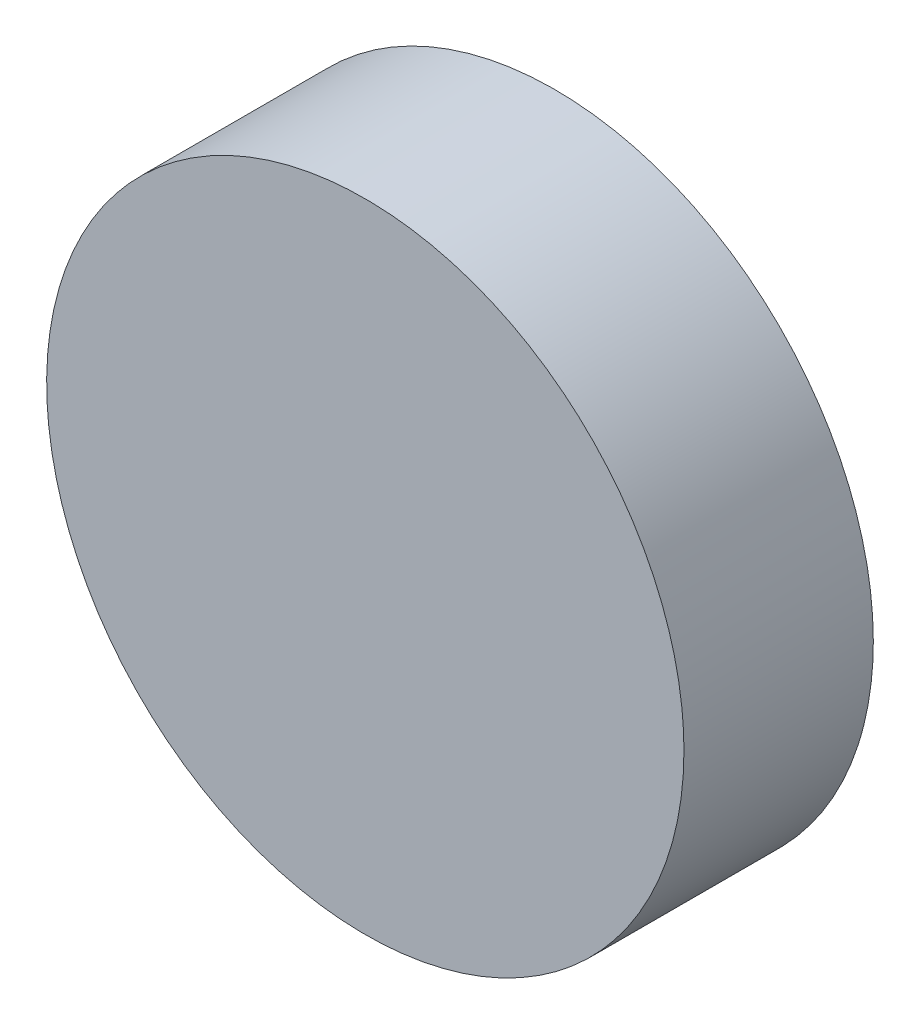
ISO-10303-21;
HEADER;
FILE_DESCRIPTION(('STEP AP214'),'2;1');
FILE_NAME('part.step','',(''),(''),'','','');
FILE_SCHEMA(('AUTOMOTIVE_DESIGN { 1 0 10303 214 1 1 1 1 }'));
ENDSEC;
DATA;
#1=APPLICATION_CONTEXT('core data for automotive mechanical design processes');
#2=APPLICATION_PROTOCOL_DEFINITION('international standard','automotive_design',2000,#1);
#3=PRODUCT_CONTEXT('',#1,'mechanical');
#4=PRODUCT('Part','Part','',(#3));
#5=PRODUCT_RELATED_PRODUCT_CATEGORY('part','',(#4));
#6=PRODUCT_DEFINITION_FORMATION('','',#4);
#7=PRODUCT_DEFINITION_CONTEXT('part definition',#1,'design');
#8=PRODUCT_DEFINITION('design','',#6,#7);
#9=PRODUCT_DEFINITION_SHAPE('','',#8);
#10=(LENGTH_UNIT() NAMED_UNIT(*) SI_UNIT(.MILLI.,.METRE.));
#11=(NAMED_UNIT(*) PLANE_ANGLE_UNIT() SI_UNIT($,.RADIAN.));
#12=(NAMED_UNIT(*) SI_UNIT($,.STERADIAN.) SOLID_ANGLE_UNIT());
#13=UNCERTAINTY_MEASURE_WITH_UNIT(LENGTH_MEASURE(1.E-05),#10,'distance_accuracy_value','');
#14=(GEOMETRIC_REPRESENTATION_CONTEXT(3) GLOBAL_UNCERTAINTY_ASSIGNED_CONTEXT((#13)) GLOBAL_UNIT_ASSIGNED_CONTEXT((#10,
#11,#12)) REPRESENTATION_CONTEXT('',''));
#15=CARTESIAN_POINT('',(0.,0.,0.));
#16=DIRECTION('',(0.,0.,1.));
#17=DIRECTION('',(1.,0.,0.));
#18=AXIS2_PLACEMENT_3D('',#15,#16,#17);
#19=CARTESIAN_POINT('',(522.173798361625,24.6841291296524,6.00670271108685));
#20=CARTESIAN_POINT('',(522.173798361625,23.7541445087742,6.00670271108685));
#21=CARTESIAN_POINT('',(521.990607380803,21.8941752670179,6.00670271108685));
#22=CARTESIAN_POINT('',(521.176807857093,19.2114377667003,6.00670271108685));
#23=CARTESIAN_POINT('',(519.855269140217,16.7390127263402,6.00670271108685));
#24=CARTESIAN_POINT('',(518.076777221937,14.5719140536869,6.00670271108685));
#25=CARTESIAN_POINT('',(515.909678549284,12.7934221354073,6.00670271108685));
#26=CARTESIAN_POINT('',(513.437253508924,11.4718834185313,6.00670271108685));
#27=CARTESIAN_POINT('',(510.754516008606,10.6580838948209,6.00670271108685));
#28=CARTESIAN_POINT('',(507.964562145972,10.3832974235883,6.00670271108685));
#29=CARTESIAN_POINT('',(505.174608283337,10.6580838948209,6.00670271108685));
#30=CARTESIAN_POINT('',(502.49187078302,11.4718834185313,6.00670271108685));
#31=CARTESIAN_POINT('',(500.01944574266,12.7934221354073,6.00670271108685));
#32=CARTESIAN_POINT('',(497.852347070006,14.5719140536869,6.00670271108685));
#33=CARTESIAN_POINT('',(496.073855151727,16.7390127263402,6.00670271108685));
#34=CARTESIAN_POINT('',(494.752316434851,19.2114377667003,6.00670271108685));
#35=CARTESIAN_POINT('',(493.93851691114,21.8941752670179,6.00670271108685));
#36=CARTESIAN_POINT('',(493.663730439908,24.6841291296524,6.00670271108685));
#37=CARTESIAN_POINT('',(493.93851691114,27.4740829922869,6.00670271108685));
#38=CARTESIAN_POINT('',(494.752316434851,30.1568204926045,6.00670271108685));
#39=CARTESIAN_POINT('',(496.073855151727,32.6292455329645,6.00670271108685));
#40=CARTESIAN_POINT('',(497.852347070006,34.7963442056179,6.00670271108685));
#41=CARTESIAN_POINT('',(500.01944574266,36.5748361238975,6.00670271108685));
#42=CARTESIAN_POINT('',(502.49187078302,37.8963748407734,6.00670271108685));
#43=CARTESIAN_POINT('',(505.174608283337,38.7101743644839,6.00670271108685));
#44=CARTESIAN_POINT('',(507.964562145972,38.9849608357165,6.00670271108685));
#45=CARTESIAN_POINT('',(510.754516008606,38.7101743644839,6.00670271108685));
#46=CARTESIAN_POINT('',(513.437253508924,37.8963748407735,6.00670271108685));
#47=CARTESIAN_POINT('',(515.909678549284,36.5748361238975,6.00670271108685));
#48=CARTESIAN_POINT('',(518.076777221937,34.7963442056179,6.00670271108685));
#49=CARTESIAN_POINT('',(519.855269140217,32.6292455329645,6.00670271108685));
#50=CARTESIAN_POINT('',(521.176807857093,30.1568204926045,6.00670271108685));
#51=CARTESIAN_POINT('',(521.990607380803,27.4740829922869,6.00670271108685));
#52=CARTESIAN_POINT('',(522.173798361625,25.6141137505305,6.00670271108685));
#53=CARTESIAN_POINT('',(522.173798361625,24.6841291296524,6.00670271108685));
#54=B_SPLINE_CURVE_WITH_KNOTS('',3,(#19,#20,#21,#22,#23,#24,#25,#26,#27,#28,#29,#30,#31,#32,#33,
#34,#35,#36,#37,#38,#39,#40,#41,#42,#43,#44,#45,#46,#47,#48,#49,#50,#51,#52,#53),.UNSPECIFIED.,
.T.,.F.,(4,1,1,1,1,1,1,1,1,1,1,1,1,1,1,1,1,1,1,1,1,1,1,1,1,1,1,1,1,1,1,1,4),(0.,0.03125,0.0625,
0.09375,0.125,0.15625,0.1875,0.218750000000001,0.25,0.281249999999999,0.3125,0.34375,0.375,
0.40625,0.4375,0.46875,0.5,0.53125,0.5625,0.59375,0.625,0.65625,0.6875,0.718749999999999,0.75,
0.781249999999999,0.8125,0.84375,0.875,0.90625,0.9375,0.96875,1.),.UNSPECIFIED.);
#55=DIRECTION('',(0.,0.,-1.));
#56=VECTOR('',#55,1.);
#57=SURFACE_OF_LINEAR_EXTRUSION('',#54,#56);
#58=CARTESIAN_POINT('',(522.173798361625,24.6841291296524,6.00670271108685));
#59=CARTESIAN_POINT('',(522.173798361625,23.7541445087742,6.00670271108685));
#60=CARTESIAN_POINT('',(521.990607380803,21.8941752670179,6.00670271108685));
#61=CARTESIAN_POINT('',(521.176807857093,19.2114377667003,6.00670271108685));
#62=CARTESIAN_POINT('',(519.855269140217,16.7390127263402,6.00670271108685));
#63=CARTESIAN_POINT('',(518.076777221937,14.5719140536869,6.00670271108685));
#64=CARTESIAN_POINT('',(515.909678549284,12.7934221354073,6.00670271108685));
#65=CARTESIAN_POINT('',(513.437253508924,11.4718834185313,6.00670271108685));
#66=CARTESIAN_POINT('',(510.754516008606,10.6580838948209,6.00670271108685));
#67=CARTESIAN_POINT('',(507.964562145972,10.3832974235883,6.00670271108685));
#68=CARTESIAN_POINT('',(505.174608283337,10.6580838948209,6.00670271108685));
#69=CARTESIAN_POINT('',(502.49187078302,11.4718834185313,6.00670271108685));
#70=CARTESIAN_POINT('',(500.01944574266,12.7934221354073,6.00670271108685));
#71=CARTESIAN_POINT('',(497.852347070006,14.5719140536869,6.00670271108685));
#72=CARTESIAN_POINT('',(496.073855151727,16.7390127263402,6.00670271108685));
#73=CARTESIAN_POINT('',(494.752316434851,19.2114377667003,6.00670271108685));
#74=CARTESIAN_POINT('',(493.93851691114,21.8941752670179,6.00670271108685));
#75=CARTESIAN_POINT('',(493.663730439908,24.6841291296524,6.00670271108685));
#76=CARTESIAN_POINT('',(493.93851691114,27.4740829922869,6.00670271108685));
#77=CARTESIAN_POINT('',(494.752316434851,30.1568204926045,6.00670271108685));
#78=CARTESIAN_POINT('',(496.073855151727,32.6292455329645,6.00670271108685));
#79=CARTESIAN_POINT('',(497.852347070006,34.7963442056179,6.00670271108685));
#80=CARTESIAN_POINT('',(500.01944574266,36.5748361238975,6.00670271108685));
#81=CARTESIAN_POINT('',(502.49187078302,37.8963748407734,6.00670271108685));
#82=CARTESIAN_POINT('',(505.174608283337,38.7101743644839,6.00670271108685));
#83=CARTESIAN_POINT('',(507.964562145972,38.9849608357165,6.00670271108685));
#84=CARTESIAN_POINT('',(510.754516008606,38.7101743644839,6.00670271108685));
#85=CARTESIAN_POINT('',(513.437253508924,37.8963748407735,6.00670271108685));
#86=CARTESIAN_POINT('',(515.909678549284,36.5748361238975,6.00670271108685));
#87=CARTESIAN_POINT('',(518.076777221937,34.7963442056179,6.00670271108685));
#88=CARTESIAN_POINT('',(519.855269140217,32.6292455329645,6.00670271108685));
#89=CARTESIAN_POINT('',(521.176807857093,30.1568204926045,6.00670271108685));
#90=CARTESIAN_POINT('',(521.990607380803,27.4740829922869,6.00670271108685));
#91=CARTESIAN_POINT('',(522.173798361625,25.6141137505305,6.00670271108685));
#92=CARTESIAN_POINT('',(522.173798361625,24.6841291296524,6.00670271108685));
#93=B_SPLINE_CURVE_WITH_KNOTS('',3,(#58,#59,#60,#61,#62,#63,#64,#65,#66,#67,#68,#69,#70,#71,#72,
#73,#74,#75,#76,#77,#78,#79,#80,#81,#82,#83,#84,#85,#86,#87,#88,#89,#90,#91,#92),.UNSPECIFIED.,
.T.,.F.,(4,1,1,1,1,1,1,1,1,1,1,1,1,1,1,1,1,1,1,1,1,1,1,1,1,1,1,1,1,1,1,1,4),(0.,0.03125,0.0625,
0.09375,0.125,0.15625,0.1875,0.218750000000001,0.25,0.281249999999999,0.3125,0.34375,0.375,
0.40625,0.4375,0.46875,0.5,0.53125,0.5625,0.59375,0.625,0.65625,0.6875,0.718749999999999,0.75,
0.781249999999999,0.8125,0.84375,0.875,0.90625,0.9375,0.96875,1.),.UNSPECIFIED.);
#94=CARTESIAN_POINT('',(522.173798361625,24.6841291296524,6.00670271108685));
#95=VERTEX_POINT('',#94);
#96=EDGE_CURVE('E9',#95,#95,#93,.T.);
#97=ORIENTED_EDGE('',*,*,#96,.T.);
#98=EDGE_LOOP('',(#97));
#99=FACE_BOUND('',#98,.T.);
#100=CARTESIAN_POINT('',(522.173798361625,24.6841291296524,-2.43755516491427));
#101=CARTESIAN_POINT('',(522.1737983134,24.9166267124824,-2.43755516491427));
#102=CARTESIAN_POINT('',(522.168073575107,25.1491226032246,-2.43755516491427));
#103=CARTESIAN_POINT('',(522.145229749942,25.6135559726698,-2.43755516491427));
#104=CARTESIAN_POINT('',(522.128110574561,25.845493447021,-2.43755516491427));
#105=CARTESIAN_POINT('',(522.082532908489,26.3082513264884,-2.43755516491427));
#106=CARTESIAN_POINT('',(522.054074417799,26.5390717316045,-2.43755516491427));
#107=CARTESIAN_POINT('',(521.985872774734,26.999038234224,-2.43755516491427));
#108=CARTESIAN_POINT('',(521.946129710019,27.228184344719,-2.43755516491427));
#109=CARTESIAN_POINT('',(521.855414034095,27.6842428524158,-2.43755516491427));
#110=CARTESIAN_POINT('',(521.804441422888,27.9111552496175,-2.43755516491427));
#111=CARTESIAN_POINT('',(521.691429952466,28.3622085586276,-2.43755516491427));
#112=CARTESIAN_POINT('',(521.629391007295,28.5863494488938,-2.43755516491427));
#113=CARTESIAN_POINT('',(521.4944095537,29.0313236684028,-2.43755516491427));
#114=CARTESIAN_POINT('',(521.421467045276,29.2521569976457,-2.43755516491427));
#115=CARTESIAN_POINT('',(521.264840855403,29.6899799286961,-2.43755516491427));
#116=CARTESIAN_POINT('',(521.181157257393,29.9069695603476,-2.43755516491427));
#117=CARTESIAN_POINT('',(521.003212059071,30.3365672715422,-2.43755516491427));
#118=CARTESIAN_POINT('',(520.908950458758,30.5491753510853,-2.43755516491427));
#119=CARTESIAN_POINT('',(520.710114336095,30.9695143556906,-2.43755516491427));
#120=CARTESIAN_POINT('',(520.60553973364,31.1772452428548,-2.43755516491427));
#121=CARTESIAN_POINT('',(520.386341747229,31.5873358315616,-2.43755516491427));
#122=CARTESIAN_POINT('',(520.271718363274,31.7896955331041,-2.43755516491427));
#123=CARTESIAN_POINT('',(520.032686685069,32.1885495656699,-2.43755516491427));
#124=CARTESIAN_POINT('',(519.908278466834,32.3850439422422,-2.43755516491427));
#125=CARTESIAN_POINT('',(519.649942079799,32.7716716677847,-2.43755516491427));
#126=CARTESIAN_POINT('',(519.516013910999,32.9618050167549,-2.43755516491427));
#127=CARTESIAN_POINT('',(519.238994296911,33.3352763220657,-2.43755516491427));
#128=CARTESIAN_POINT('',(519.095902780451,33.518614225609,-2.43755516491427));
#129=CARTESIAN_POINT('',(518.80091191688,33.8780616328868,-2.43755516491427));
#130=CARTESIAN_POINT('',(518.649012569768,34.0541711366212,-2.43755516491427));
#131=CARTESIAN_POINT('',(518.336761256584,34.3987285337191,-2.43755516491427));
#132=CARTESIAN_POINT('',(518.176409356178,34.567176486586,-2.43755516491427));
#133=CARTESIAN_POINT('',(517.847609502905,34.8959763398585,-2.43755516491427));
#134=CARTESIAN_POINT('',(517.679161550039,35.0563282402642,-2.43755516491427));
#135=CARTESIAN_POINT('',(517.334604152941,35.3685795534488,-2.43755516491427));
#136=CARTESIAN_POINT('',(517.158494649206,35.52047890056,-2.43755516491427));
#137=CARTESIAN_POINT('',(516.799047241929,35.8154697641312,-2.43755516491427));
#138=CARTESIAN_POINT('',(516.615709338385,35.9585612805912,-2.43755516491427));
#139=CARTESIAN_POINT('',(516.242238033074,36.2355808946797,-2.43755516491427));
#140=CARTESIAN_POINT('',(516.052104684104,36.3695090634795,-2.43755516491427));
#141=CARTESIAN_POINT('',(515.665476958562,36.6278454505142,-2.43755516491427));
#142=CARTESIAN_POINT('',(515.46898258199,36.752253668749,-2.43755516491427));
#143=CARTESIAN_POINT('',(515.070128549423,36.9912853469542,-2.43755516491427));
#144=CARTESIAN_POINT('',(514.867768847879,37.1059087309101,-2.43755516491427));
#145=CARTESIAN_POINT('',(514.457678259176,37.3251067173205,-2.43755516491427));
#146=CARTESIAN_POINT('',(514.249947372017,37.4296813197749,-2.43755516491427));
#147=CARTESIAN_POINT('',(513.829608367398,37.6285174424391,-2.43755516491427));
#148=CARTESIAN_POINT('',(513.617000287836,37.7227790427527,-2.43755516491427));
#149=CARTESIAN_POINT('',(513.187402576693,37.9007242410724,-2.43755516491427));
#150=CARTESIAN_POINT('',(512.970412945112,37.9844078390786,-2.43755516491427));
#151=CARTESIAN_POINT('',(512.532590013868,38.1410340289614,-2.43755516491427));
#152=CARTESIAN_POINT('',(512.311756684361,38.213976537398,-2.43755516491427));
#153=CARTESIAN_POINT('',(511.866782465575,38.3489579909575,-2.43755516491427));
#154=CARTESIAN_POINT('',(511.642641576296,38.4109969360803,-2.43755516491427));
#155=CARTESIAN_POINT('',(511.191588264588,38.5240084066346,-2.43755516491427));
#156=CARTESIAN_POINT('',(510.964675863699,38.5749810180245,-2.43755516491427));
#157=CARTESIAN_POINT('',(510.508617366074,38.6656966934507,-2.43755516491427));
#158=CARTESIAN_POINT('',(510.279471269337,38.7054397574871,-2.43755516491427));
#159=CARTESIAN_POINT('',(509.81950472913,38.7736414024073,-2.43755516491427));
#160=CARTESIAN_POINT('',(509.588684272667,38.8020998956322,-2.43755516491427));
#161=CARTESIAN_POINT('',(509.125926533482,38.8476775547789,-2.43755516491427));
#162=CARTESIAN_POINT('',(508.893989250759,38.8647967207008,-2.43755516491427));
#163=CARTESIAN_POINT('',(508.429555357776,38.8876405717095,-2.43755516491427));
#164=CARTESIAN_POINT('',(508.197058751874,38.8933653453056,-2.43755516491427));
#165=CARTESIAN_POINT('',(507.73206554007,38.8933653453056,-2.43755516491427));
#166=CARTESIAN_POINT('',(507.499568934167,38.8876405717095,-2.43755516491427));
#167=CARTESIAN_POINT('',(507.035135041184,38.8647967207008,-2.43755516491427));
#168=CARTESIAN_POINT('',(506.803197758462,38.8476775547789,-2.43755516491427));
#169=CARTESIAN_POINT('',(506.340440019277,38.8020998956322,-2.43755516491427));
#170=CARTESIAN_POINT('',(506.109619562814,38.7736414024073,-2.43755516491427));
#171=CARTESIAN_POINT('',(505.649653022606,38.7054397574871,-2.43755516491427));
#172=CARTESIAN_POINT('',(505.420506925869,38.6656966934507,-2.43755516491427));
#173=CARTESIAN_POINT('',(504.964448428244,38.5749810180245,-2.43755516491427));
#174=CARTESIAN_POINT('',(504.737536027356,38.5240084066346,-2.43755516491427));
#175=CARTESIAN_POINT('',(504.286482715647,38.4109969360803,-2.43755516491427));
#176=CARTESIAN_POINT('',(504.062341826369,38.3489579909575,-2.43755516491427));
#177=CARTESIAN_POINT('',(503.617367607583,38.213976537398,-2.43755516491427));
#178=CARTESIAN_POINT('',(503.396534278075,38.1410340289613,-2.43755516491427));
#179=CARTESIAN_POINT('',(502.958711346831,37.9844078390785,-2.43755516491427));
#180=CARTESIAN_POINT('',(502.741721715251,37.9007242410724,-2.43755516491427));
#181=CARTESIAN_POINT('',(502.312124004108,37.7227790427527,-2.43755516491427));
#182=CARTESIAN_POINT('',(502.099515924546,37.6285174424391,-2.43755516491427));
#183=CARTESIAN_POINT('',(501.679176919927,37.4296813197749,-2.43755516491427));
#184=CARTESIAN_POINT('',(501.471446032768,37.3251067173204,-2.43755516491427));
#185=CARTESIAN_POINT('',(501.061355444064,37.1059087309101,-2.43755516491427));
#186=CARTESIAN_POINT('',(500.858995742521,36.9912853469542,-2.43755516491427));
#187=CARTESIAN_POINT('',(500.460141709954,36.752253668749,-2.43755516491427));
#188=CARTESIAN_POINT('',(500.263647333382,36.6278454505142,-2.43755516491427));
#189=CARTESIAN_POINT('',(499.87701960784,36.3695090634795,-2.43755516491427));
#190=CARTESIAN_POINT('',(499.686886258869,36.2355808946797,-2.43755516491427));
#191=CARTESIAN_POINT('',(499.313414953558,35.9585612805912,-2.43755516491427));
#192=CARTESIAN_POINT('',(499.130077050015,35.8154697641313,-2.43755516491427));
#193=CARTESIAN_POINT('',(498.770629642737,35.5204789005601,-2.43755516491427));
#194=CARTESIAN_POINT('',(498.594520139003,35.3685795534488,-2.43755516491427));
#195=CARTESIAN_POINT('',(498.249962741905,35.0563282402642,-2.43755516491427));
#196=CARTESIAN_POINT('',(498.081514789038,34.8959763398585,-2.43755516491427));
#197=CARTESIAN_POINT('',(497.752714935766,34.567176486586,-2.43755516491427));
#198=CARTESIAN_POINT('',(497.59236303536,34.3987285337191,-2.43755516491427));
#199=CARTESIAN_POINT('',(497.280111722175,34.0541711366212,-2.43755516491427));
#200=CARTESIAN_POINT('',(497.128212375064,33.8780616328867,-2.43755516491427));
#201=CARTESIAN_POINT('',(496.833221511493,33.518614225609,-2.43755516491427));
#202=CARTESIAN_POINT('',(496.690129995033,33.3352763220658,-2.43755516491427));
#203=CARTESIAN_POINT('',(496.413110380945,32.9618050167549,-2.43755516491427));
#204=CARTESIAN_POINT('',(496.279182212145,32.7716716677845,-2.43755516491427));
#205=CARTESIAN_POINT('',(496.02084582511,32.3850439422423,-2.43755516491427));
#206=CARTESIAN_POINT('',(495.896437606875,32.1885495656704,-2.43755516491427));
#207=CARTESIAN_POINT('',(495.65740592867,31.7896955331036,-2.43755516491427));
#208=CARTESIAN_POINT('',(495.542782544714,31.5873358315597,-2.43755516491427));
#209=CARTESIAN_POINT('',(495.323584558304,31.1772452428567,-2.43755516491427));
#210=CARTESIAN_POINT('',(495.219009955849,30.9695143556975,-2.43755516491427));
#211=CARTESIAN_POINT('',(495.020173833185,30.5491753510783,-2.43755516491427));
#212=CARTESIAN_POINT('',(494.925912232871,30.3365672715162,-2.43755516491427));
#213=CARTESIAN_POINT('',(494.747967034552,29.9069695603736,-2.43755516491427));
#214=CARTESIAN_POINT('',(494.664283436546,29.689979928793,-2.43755516491427));
#215=CARTESIAN_POINT('',(494.507657246663,29.2521569975489,-2.43755516491427));
#216=CARTESIAN_POINT('',(494.434714738226,29.0313236680413,-2.43755516491427));
#217=CARTESIAN_POINT('',(494.299733284667,28.5863494492553,-2.43755516491427));
#218=CARTESIAN_POINT('',(494.237694339544,28.362208559977,-2.43755516491427));
#219=CARTESIAN_POINT('',(494.12468286899,27.9111552482681,-2.43755516491427));
#220=CARTESIAN_POINT('',(494.0737102576,27.6842428473799,-2.43755516491427));
#221=CARTESIAN_POINT('',(493.982994582174,27.2281843497549,-2.43755516491427));
#222=CARTESIAN_POINT('',(493.943251518137,26.999038253018,-2.43755516491427));
#223=CARTESIAN_POINT('',(493.875049873217,26.5390717128104,-2.43755516491427));
#224=CARTESIAN_POINT('',(493.846591379992,26.3082512563473,-2.43755516491427));
#225=CARTESIAN_POINT('',(493.801013720845,25.8454935171621,-2.43755516491427));
#226=CARTESIAN_POINT('',(493.783894554923,25.6135562344398,-2.43755516491427));
#227=CARTESIAN_POINT('',(493.761050703915,25.1491223414567,-2.43755516491427));
#228=CARTESIAN_POINT('',(493.755325930319,24.9166257355545,-2.43755516491427));
#229=CARTESIAN_POINT('',(493.755325930319,24.4516325237502,-2.43755516491427));
#230=CARTESIAN_POINT('',(493.761050703915,24.2191359178481,-2.43755516491427));
#231=CARTESIAN_POINT('',(493.783894554923,23.7547020248649,-2.43755516491428));
#232=CARTESIAN_POINT('',(493.801013720845,23.5227647421427,-2.43755516491427));
#233=CARTESIAN_POINT('',(493.846591379992,23.0600070029574,-2.43755516491427));
#234=CARTESIAN_POINT('',(493.875049873217,22.8291865464944,-2.43755516491427));
#235=CARTESIAN_POINT('',(493.943251518137,22.3692200062868,-2.43755516491427));
#236=CARTESIAN_POINT('',(493.982994582173,22.1400739095499,-2.43755516491427));
#237=CARTESIAN_POINT('',(494.0737102576,21.6840154119248,-2.43755516491427));
#238=CARTESIAN_POINT('',(494.124682868989,21.4571030110366,-2.43755516491427));
#239=CARTESIAN_POINT('',(494.237694339544,21.0060496993277,-2.43755516491427));
#240=CARTESIAN_POINT('',(494.299733284667,20.7819088100494,-2.43755516491427));
#241=CARTESIAN_POINT('',(494.434714738226,20.3369345912635,-2.43755516491427));
#242=CARTESIAN_POINT('',(494.507657246663,20.1161012617559,-2.43755516491427));
#243=CARTESIAN_POINT('',(494.664283436546,19.6782783305118,-2.43755516491427));
#244=CARTESIAN_POINT('',(494.747967034552,19.4612886989312,-2.43755516491427));
#245=CARTESIAN_POINT('',(494.925912232871,19.0316909877885,-2.43755516491427));
#246=CARTESIAN_POINT('',(495.020173833185,18.8190829082264,-2.43755516491427));
#247=CARTESIAN_POINT('',(495.219009955849,18.3987439036072,-2.43755516491427));
#248=CARTESIAN_POINT('',(495.323584558304,18.1910130164481,-2.43755516491427));
#249=CARTESIAN_POINT('',(495.542782544714,17.7809224277451,-2.43755516491427));
#250=CARTESIAN_POINT('',(495.65740592867,17.5785627262012,-2.43755516491427));
#251=CARTESIAN_POINT('',(495.896437606875,17.1797086936343,-2.43755516491427));
#252=CARTESIAN_POINT('',(496.02084582511,16.9832143170624,-2.43755516491427));
#253=CARTESIAN_POINT('',(496.279182212145,16.5965865915202,-2.43755516491427));
#254=CARTESIAN_POINT('',(496.413110380944,16.4064532425499,-2.43755516491427));
#255=CARTESIAN_POINT('',(496.690129995033,16.032981937239,-2.43755516491427));
#256=CARTESIAN_POINT('',(496.833221511493,15.8496440336958,-2.43755516491427));
#257=CARTESIAN_POINT('',(497.128212375064,15.490196626418,-2.43755516491427));
#258=CARTESIAN_POINT('',(497.280111722175,15.3140871226835,-2.43755516491427));
#259=CARTESIAN_POINT('',(497.59236303536,14.9695297255856,-2.43755516491427));
#260=CARTESIAN_POINT('',(497.752714935766,14.8010817727188,-2.43755516491427));
#261=CARTESIAN_POINT('',(498.081514789038,14.4722819194462,-2.43755516491427));
#262=CARTESIAN_POINT('',(498.249962741905,14.3119300190405,-2.43755516491427));
#263=CARTESIAN_POINT('',(498.594520139003,13.9996787058559,-2.43755516491427));
#264=CARTESIAN_POINT('',(498.770629642738,13.8477793587447,-2.43755516491427));
#265=CARTESIAN_POINT('',(499.130077050015,13.5527884951735,-2.43755516491427));
#266=CARTESIAN_POINT('',(499.313414953558,13.4096969787136,-2.43755516491427));
#267=CARTESIAN_POINT('',(499.686886258869,13.132677364625,-2.43755516491427));
#268=CARTESIAN_POINT('',(499.87701960784,12.9987491958252,-2.43755516491427));
#269=CARTESIAN_POINT('',(500.263647333382,12.7404128087906,-2.43755516491427));
#270=CARTESIAN_POINT('',(500.460141709954,12.6160045905557,-2.43755516491427));
#271=CARTESIAN_POINT('',(500.858995742521,12.3769729123506,-2.43755516491427));
#272=CARTESIAN_POINT('',(501.061355444065,12.2623495283947,-2.43755516491427));
#273=CARTESIAN_POINT('',(501.471446032768,12.0431515419843,-2.43755516491427));
#274=CARTESIAN_POINT('',(501.679176919927,11.9385769395298,-2.43755516491427));
#275=CARTESIAN_POINT('',(502.099515924546,11.7397408168657,-2.43755516491427));
#276=CARTESIAN_POINT('',(502.312124004108,11.6454792165521,-2.43755516491427));
#277=CARTESIAN_POINT('',(502.741721715251,11.4675340182324,-2.43755516491427));
#278=CARTESIAN_POINT('',(502.958711346831,11.3838504202262,-2.43755516491427));
#279=CARTESIAN_POINT('',(503.396534278075,11.2272242303434,-2.43755516491427));
#280=CARTESIAN_POINT('',(503.617367607583,11.1542817219067,-2.43755516491427));
#281=CARTESIAN_POINT('',(504.062341826369,11.0193002683472,-2.43755516491427));
#282=CARTESIAN_POINT('',(504.286482715647,10.9572613232245,-2.43755516491427));
#283=CARTESIAN_POINT('',(504.737536027356,10.8442498526701,-2.43755516491427));
#284=CARTESIAN_POINT('',(504.964448428244,10.7932772412803,-2.43755516491427));
#285=CARTESIAN_POINT('',(505.420506925869,10.7025615658541,-2.43755516491427));
#286=CARTESIAN_POINT('',(505.649653022606,10.6628185018177,-2.43755516491427));
#287=CARTESIAN_POINT('',(506.109619562814,10.5946168568974,-2.43755516491427));
#288=CARTESIAN_POINT('',(506.340440019277,10.5661583636726,-2.43755516491427));
#289=CARTESIAN_POINT('',(506.803197758462,10.5205807045258,-2.43755516491427));
#290=CARTESIAN_POINT('',(507.035135041184,10.5034615386039,-2.43755516491427));
#291=CARTESIAN_POINT('',(507.499568934168,10.4806176875953,-2.43755516491427));
#292=CARTESIAN_POINT('',(507.73206554007,10.4748929139991,-2.43755516491427));
#293=CARTESIAN_POINT('',(508.197058751874,10.4748929139991,-2.43755516491427));
#294=CARTESIAN_POINT('',(508.429555357776,10.4806176875953,-2.43755516491427));
#295=CARTESIAN_POINT('',(508.893989250759,10.5034615386039,-2.43755516491427));
#296=CARTESIAN_POINT('',(509.125926533482,10.5205807045258,-2.43755516491427));
#297=CARTESIAN_POINT('',(509.588684272667,10.5661583636726,-2.43755516491427));
#298=CARTESIAN_POINT('',(509.81950472913,10.5946168568974,-2.43755516491427));
#299=CARTESIAN_POINT('',(510.279471269337,10.6628185018177,-2.43755516491427));
#300=CARTESIAN_POINT('',(510.508617366074,10.7025615658541,-2.43755516491427));
#301=CARTESIAN_POINT('',(510.964675863699,10.7932772412803,-2.43755516491427));
#302=CARTESIAN_POINT('',(511.191588264588,10.8442498526701,-2.43755516491427));
#303=CARTESIAN_POINT('',(511.642641576296,10.9572613232245,-2.43755516491427));
#304=CARTESIAN_POINT('',(511.866782465575,11.0193002683473,-2.43755516491427));
#305=CARTESIAN_POINT('',(512.311756684361,11.1542817219067,-2.43755516491427));
#306=CARTESIAN_POINT('',(512.532590013868,11.2272242303434,-2.43755516491427));
#307=CARTESIAN_POINT('',(512.970412945112,11.3838504202262,-2.43755516491427));
#308=CARTESIAN_POINT('',(513.187402576693,11.4675340182324,-2.43755516491427));
#309=CARTESIAN_POINT('',(513.617000287836,11.6454792165521,-2.43755516491427));
#310=CARTESIAN_POINT('',(513.829608367398,11.7397408168657,-2.43755516491427));
#311=CARTESIAN_POINT('',(514.249947372017,11.9385769395298,-2.43755516491427));
#312=CARTESIAN_POINT('',(514.457678259176,12.0431515419843,-2.43755516491427));
#313=CARTESIAN_POINT('',(514.867768847879,12.2623495283947,-2.43755516491427));
#314=CARTESIAN_POINT('',(515.070128549423,12.3769729123506,-2.43755516491427));
#315=CARTESIAN_POINT('',(515.46898258199,12.6160045905557,-2.43755516491427));
#316=CARTESIAN_POINT('',(515.665476958562,12.7404128087906,-2.43755516491427));
#317=CARTESIAN_POINT('',(516.052104684104,12.9987491958252,-2.43755516491427));
#318=CARTESIAN_POINT('',(516.242238033074,13.132677364625,-2.43755516491427));
#319=CARTESIAN_POINT('',(516.615709338385,13.4096969787136,-2.43755516491427));
#320=CARTESIAN_POINT('',(516.799047241929,13.5527884951735,-2.43755516491427));
#321=CARTESIAN_POINT('',(517.158494649206,13.8477793587447,-2.43755516491427));
#322=CARTESIAN_POINT('',(517.334604152941,13.999678705856,-2.43755516491427));
#323=CARTESIAN_POINT('',(517.679161550039,14.3119300190405,-2.43755516491427));
#324=CARTESIAN_POINT('',(517.847609502905,14.4722819194462,-2.43755516491427));
#325=CARTESIAN_POINT('',(518.176409356178,14.8010817727188,-2.43755516491427));
#326=CARTESIAN_POINT('',(518.336761256584,14.9695297255856,-2.43755516491427));
#327=CARTESIAN_POINT('',(518.649012569768,15.3140871226835,-2.43755516491427));
#328=CARTESIAN_POINT('',(518.800911916879,15.490196626418,-2.43755516491427));
#329=CARTESIAN_POINT('',(519.095902780451,15.8496440336958,-2.43755516491427));
#330=CARTESIAN_POINT('',(519.238994296911,16.032981937239,-2.43755516491427));
#331=CARTESIAN_POINT('',(519.516013910999,16.4064532425499,-2.43755516491427));
#332=CARTESIAN_POINT('',(519.649942079799,16.5965865915201,-2.43755516491427));
#333=CARTESIAN_POINT('',(519.908278466834,16.9832143170626,-2.43755516491427));
#334=CARTESIAN_POINT('',(520.032686685068,17.1797086936348,-2.43755516491427));
#335=CARTESIAN_POINT('',(520.271718363274,17.5785627262007,-2.43755516491427));
#336=CARTESIAN_POINT('',(520.386341747229,17.7809224277432,-2.43755516491427));
#337=CARTESIAN_POINT('',(520.60553973364,18.19101301645,-2.43755516491427));
#338=CARTESIAN_POINT('',(520.710114336095,18.3987439036142,-2.43755516491427));
#339=CARTESIAN_POINT('',(520.908950458758,18.8190829082195,-2.43755516491427));
#340=CARTESIAN_POINT('',(521.003212059071,19.0316909877626,-2.43755516491427));
#341=CARTESIAN_POINT('',(521.181157257393,19.4612886989571,-2.43755516491427));
#342=CARTESIAN_POINT('',(521.264840855403,19.6782783306087,-2.43755516491427));
#343=CARTESIAN_POINT('',(521.421467045276,20.116101261659,-2.43755516491427));
#344=CARTESIAN_POINT('',(521.4944095537,20.3369345909019,-2.43755516491427));
#345=CARTESIAN_POINT('',(521.629391007295,20.781908810411,-2.43755516491427));
#346=CARTESIAN_POINT('',(521.691429952466,21.0060497006771,-2.43755516491427));
#347=CARTESIAN_POINT('',(521.804441422888,21.4571030096873,-2.43755516491427));
#348=CARTESIAN_POINT('',(521.855414034095,21.684015406889,-2.43755516491427));
#349=CARTESIAN_POINT('',(521.946129710019,22.1400739145857,-2.43755516491427));
#350=CARTESIAN_POINT('',(521.985872774734,22.3692200250808,-2.43755516491427));
#351=CARTESIAN_POINT('',(522.054074417799,22.8291865277002,-2.43755516491427));
#352=CARTESIAN_POINT('',(522.082532908489,23.0600069328164,-2.43755516491427));
#353=CARTESIAN_POINT('',(522.128110574561,23.5227648122837,-2.43755516491427));
#354=CARTESIAN_POINT('',(522.145229749942,23.754702286635,-2.43755516491427));
#355=CARTESIAN_POINT('',(522.168073575107,24.2191356560801,-2.43755516491427));
#356=CARTESIAN_POINT('',(522.1737983134,24.4516315468223,-2.43755516491427));
#357=CARTESIAN_POINT('',(522.173798361625,24.6841291296524,-2.43755516491427));
#358=B_SPLINE_CURVE_WITH_KNOTS('',3,(#100,#101,#102,#103,#104,#105,#106,#107,#108,#109,#110,
#111,#112,#113,#114,#115,#116,#117,#118,#119,#120,#121,#122,#123,#124,#125,#126,#127,#128,#129,
#130,#131,#132,#133,#134,#135,#136,#137,#138,#139,#140,#141,#142,#143,#144,#145,#146,#147,#148,
#149,#150,#151,#152,#153,#154,#155,#156,#157,#158,#159,#160,#161,#162,#163,#164,#165,#166,#167,
#168,#169,#170,#171,#172,#173,#174,#175,#176,#177,#178,#179,#180,#181,#182,#183,#184,#185,#186,
#187,#188,#189,#190,#191,#192,#193,#194,#195,#196,#197,#198,#199,#200,#201,#202,#203,#204,#205,
#206,#207,#208,#209,#210,#211,#212,#213,#214,#215,#216,#217,#218,#219,#220,#221,#222,#223,#224,
#225,#226,#227,#228,#229,#230,#231,#232,#233,#234,#235,#236,#237,#238,#239,#240,#241,#242,#243,
#244,#245,#246,#247,#248,#249,#250,#251,#252,#253,#254,#255,#256,#257,#258,#259,#260,#261,#262,
#263,#264,#265,#266,#267,#268,#269,#270,#271,#272,#273,#274,#275,#276,#277,#278,#279,#280,#281,
#282,#283,#284,#285,#286,#287,#288,#289,#290,#291,#292,#293,#294,#295,#296,#297,#298,#299,#300,
#301,#302,#303,#304,#305,#306,#307,#308,#309,#310,#311,#312,#313,#314,#315,#316,#317,#318,#319,
#320,#321,#322,#323,#324,#325,#326,#327,#328,#329,#330,#331,#332,#333,#334,#335,#336,#337,#338,
#339,#340,#341,#342,#343,#344,#345,#346,#347,#348,#349,#350,#351,#352,#353,#354,#355,#356,#357),
.UNSPECIFIED.,.F.,.F.,(4,2,2,2,2,2,2,2,2,2,2,2,2,2,2,2,2,2,2,2,2,2,2,2,2,2,2,2,2,2,2,2,2,2,2,2,
2,2,2,2,2,2,2,2,2,2,2,2,2,2,2,2,2,2,2,2,2,2,2,2,2,2,2,2,2,2,2,2,2,2,2,2,2,2,2,2,2,2,2,2,2,2,2,2,
2,2,2,2,2,2,2,2,2,2,2,2,2,2,2,2,2,2,2,2,2,2,2,2,2,2,2,2,2,2,2,2,2,2,2,2,2,2,2,2,2,2,2,2,4),(0.,
0.697420070655498,1.39484555879195,2.09227104692842,2.7896911175839,3.48711118823941,
4.18453667637587,4.88196216451235,5.57938223516787,6.27680230582336,6.97422779395982,
7.67165328209619,8.36907335275167,9.06649342340728,9.76391891154364,10.4613443996802,
11.1587644703356,11.8561845409912,12.5536100291276,13.2510355172641,13.9484555879195,
14.645875658575,15.3433011467115,16.040726634848,16.7381467055035,17.4355667761589,
18.1329922642955,18.8304177524319,19.5278378230874,20.2252578937428,20.9226833818793,
21.6201088700158,22.3175289406713,23.0149490113268,23.7123744994633,24.4097999875997,
25.1072200582553,25.8046401289107,26.5020656170473,27.1994911051835,27.896911175839,
28.5943312464946,29.291756734631,29.9891822227676,30.686602293423,31.3840223640785,
32.081447852215,32.7788733403514,33.4762934110069,34.1737134816624,34.8711389697988,
35.5685644579353,36.2659845285908,36.9634045992463,37.6608300873828,38.3582555755192,
39.0556756461747,39.7530957168302,40.4505212049667,41.1479466931031,41.8453667637586,
42.5427868344141,43.2402123225505,43.937637810687,44.6350578813425,45.332477951998,
46.0299034401345,46.7273289282709,47.4247489989264,48.1221690695819,48.8195945577184,
49.5170200458548,50.2144401165103,50.9118601871658,51.6092856753023,52.3067111634387,
53.0041312340942,53.7015513047498,54.3989767928862,55.0964022810227,55.7938223516782,
56.4912424223337,57.1886679104701,57.8860933986065,58.5835134692621,59.2809335399177,
59.9783590280541,60.6757845161905,61.373204586846,62.0706246575014,62.7680501456379,
63.4654756337744,64.1628957044298,64.8603157750854,65.5577412632218,66.2551667513583,
66.9525868220138,67.6500068926694,68.3474323808058,69.0448578689421,69.7422779395977,
70.4396980102532,71.1371234983896,71.8345489865262,72.5319690571816,73.2293891278371,
73.9268146159735,74.62424010411,75.3216601747655,76.019080245421,76.7165057335575,
77.4139312216939,78.1113512923494,78.8087713630049,79.5061968511414,80.2036223392778,
80.9010424099333,81.5984624805888,82.2958879687253,82.9933134568617,83.6907335275173,
84.3881535981728,85.0855790863092,85.7830045744457,86.4804246451012,87.1778447157567,
87.8752702038931,88.5726956920296,89.2701157626851),.UNSPECIFIED.);
#359=CARTESIAN_POINT('',(522.173798361625,24.6841291296524,-2.43755516491427));
#360=VERTEX_POINT('',#359);
#361=EDGE_CURVE('E24',#360,#360,#358,.F.);
#362=ORIENTED_EDGE('',*,*,#361,.F.);
#363=EDGE_LOOP('',(#362));
#364=FACE_BOUND('',#363,.T.);
#365=ADVANCED_FACE('F14',(#99,#364),#57,.T.);
#366=CARTESIAN_POINT('',(507.964562145972,10.8341291296524,6.00670271108685));
#367=DIRECTION('',(0.,0.,-1.));
#368=DIRECTION('',(0.,1.,0.));
#369=AXIS2_PLACEMENT_3D('',#366,#367,#368);
#370=PLANE('',#369);
#371=ORIENTED_EDGE('',*,*,#96,.F.);
#372=EDGE_LOOP('',(#371));
#373=FACE_BOUND('',#372,.T.);
#374=ADVANCED_FACE('F62',(#373),#370,.F.);
#375=CARTESIAN_POINT('',(507.964562145972,10.8341291296524,-2.43755516491427));
#376=DIRECTION('',(0.,0.,-1.));
#377=DIRECTION('',(0.,1.,0.));
#378=AXIS2_PLACEMENT_3D('',#375,#376,#377);
#379=PLANE('',#378);
#380=ORIENTED_EDGE('',*,*,#361,.T.);
#381=EDGE_LOOP('',(#380));
#382=FACE_BOUND('',#381,.T.);
#383=ADVANCED_FACE('F31',(#382),#379,.T.);
#384=CLOSED_SHELL('',(#365,#374,#383));
#385=MANIFOLD_SOLID_BREP('B1',#384);
#386=ADVANCED_BREP_SHAPE_REPRESENTATION('',(#18,#385),#14);
#387=SHAPE_DEFINITION_REPRESENTATION(#9,#386);
ENDSEC;
END-ISO-10303-21;
